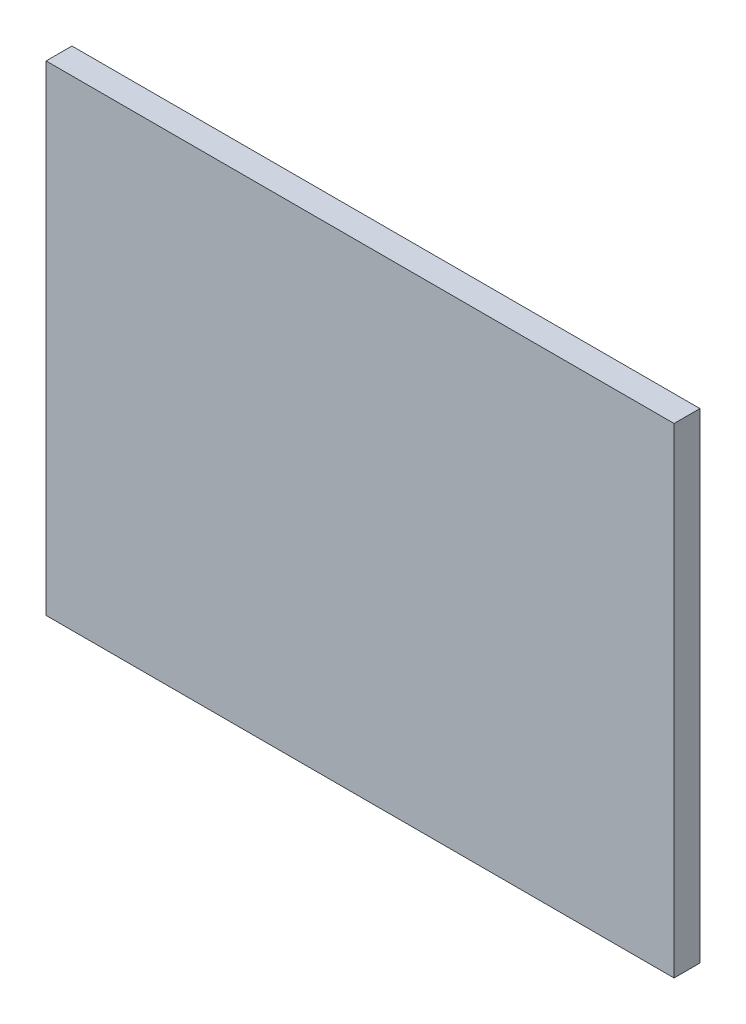
ISO-10303-21;
HEADER;
FILE_DESCRIPTION(('STEP AP214'),'2;1');
FILE_NAME('part.step','',(''),(''),'','','');
FILE_SCHEMA(('AUTOMOTIVE_DESIGN { 1 0 10303 214 1 1 1 1 }'));
ENDSEC;
DATA;
#1=APPLICATION_CONTEXT('core data for automotive mechanical design processes');
#2=APPLICATION_PROTOCOL_DEFINITION('international standard','automotive_design',2000,#1);
#3=PRODUCT_CONTEXT('',#1,'mechanical');
#4=PRODUCT('Part','Part','',(#3));
#5=PRODUCT_RELATED_PRODUCT_CATEGORY('part','',(#4));
#6=PRODUCT_DEFINITION_FORMATION('','',#4);
#7=PRODUCT_DEFINITION_CONTEXT('part definition',#1,'design');
#8=PRODUCT_DEFINITION('design','',#6,#7);
#9=PRODUCT_DEFINITION_SHAPE('','',#8);
#10=(LENGTH_UNIT() NAMED_UNIT(*) SI_UNIT(.MILLI.,.METRE.));
#11=(NAMED_UNIT(*) PLANE_ANGLE_UNIT() SI_UNIT($,.RADIAN.));
#12=(NAMED_UNIT(*) SI_UNIT($,.STERADIAN.) SOLID_ANGLE_UNIT());
#13=UNCERTAINTY_MEASURE_WITH_UNIT(LENGTH_MEASURE(1.E-05),#10,'distance_accuracy_value','');
#14=(GEOMETRIC_REPRESENTATION_CONTEXT(3) GLOBAL_UNCERTAINTY_ASSIGNED_CONTEXT((#13)) GLOBAL_UNIT_ASSIGNED_CONTEXT((#10,
#11,#12)) REPRESENTATION_CONTEXT('',''));
#15=CARTESIAN_POINT('',(0.,0.,0.));
#16=DIRECTION('',(0.,0.,1.));
#17=DIRECTION('',(1.,0.,0.));
#18=AXIS2_PLACEMENT_3D('',#15,#16,#17);
#19=CARTESIAN_POINT('',(872.3,756.75,0.));
#20=DIRECTION('',(1.,0.,0.));
#21=DIRECTION('',(0.,-1.,0.));
#22=AXIS2_PLACEMENT_3D('',#19,#20,#21);
#23=PLANE('',#22);
#24=DIRECTION('',(0.,-1.,0.));
#25=VECTOR('',#24,1.);
#26=CARTESIAN_POINT('',(872.3,756.75,0.0350012));
#27=LINE('',#26,#25);
#28=CARTESIAN_POINT('',(872.3,756.75,0.0350012));
#29=VERTEX_POINT('',#28);
#30=CARTESIAN_POINT('',(872.3,756.1,0.0350012));
#31=VERTEX_POINT('',#30);
#32=EDGE_CURVE('E11',#29,#31,#27,.T.);
#33=ORIENTED_EDGE('',*,*,#32,.F.);
#34=DIRECTION('',(0.,0.,1.));
#35=VECTOR('',#34,1.);
#36=CARTESIAN_POINT('',(872.3,756.75,0.));
#37=LINE('',#36,#35);
#38=CARTESIAN_POINT('',(872.3,756.75,0.));
#39=VERTEX_POINT('',#38);
#40=EDGE_CURVE('E24',#39,#29,#37,.T.);
#41=ORIENTED_EDGE('',*,*,#40,.F.);
#42=DIRECTION('',(0.,-1.,0.));
#43=VECTOR('',#42,1.);
#44=CARTESIAN_POINT('',(872.3,756.75,0.));
#45=LINE('',#44,#43);
#46=CARTESIAN_POINT('',(872.3,756.1,0.));
#47=VERTEX_POINT('',#46);
#48=EDGE_CURVE('E75',#39,#47,#45,.T.);
#49=ORIENTED_EDGE('',*,*,#48,.T.);
#50=DIRECTION('',(0.,0.,1.));
#51=VECTOR('',#50,1.);
#52=CARTESIAN_POINT('',(872.3,756.1,0.));
#53=LINE('',#52,#51);
#54=EDGE_CURVE('E37',#47,#31,#53,.T.);
#55=ORIENTED_EDGE('',*,*,#54,.T.);
#56=EDGE_LOOP('',(#33,#41,#49,#55));
#57=FACE_BOUND('',#56,.T.);
#58=ADVANCED_FACE('F17',(#57),#23,.F.);
#59=CARTESIAN_POINT('',(872.3,756.1,0.));
#60=DIRECTION('',(0.,1.,0.));
#61=DIRECTION('',(1.,0.,0.));
#62=AXIS2_PLACEMENT_3D('',#59,#60,#61);
#63=PLANE('',#62);
#64=DIRECTION('',(1.,0.,0.));
#65=VECTOR('',#64,1.);
#66=CARTESIAN_POINT('',(872.3,756.1,0.0350012));
#67=LINE('',#66,#65);
#68=CARTESIAN_POINT('',(873.15,756.1,0.0350012));
#69=VERTEX_POINT('',#68);
#70=EDGE_CURVE('E83',#31,#69,#67,.T.);
#71=ORIENTED_EDGE('',*,*,#70,.F.);
#72=ORIENTED_EDGE('',*,*,#54,.F.);
#73=DIRECTION('',(1.,0.,0.));
#74=VECTOR('',#73,1.);
#75=CARTESIAN_POINT('',(872.3,756.1,0.));
#76=LINE('',#75,#74);
#77=CARTESIAN_POINT('',(873.15,756.1,0.));
#78=VERTEX_POINT('',#77);
#79=EDGE_CURVE('E81',#47,#78,#76,.T.);
#80=ORIENTED_EDGE('',*,*,#79,.T.);
#81=DIRECTION('',(0.,0.,1.));
#82=VECTOR('',#81,1.);
#83=CARTESIAN_POINT('',(873.15,756.1,0.));
#84=LINE('',#83,#82);
#85=EDGE_CURVE('E67',#78,#69,#84,.T.);
#86=ORIENTED_EDGE('',*,*,#85,.T.);
#87=EDGE_LOOP('',(#71,#72,#80,#86));
#88=FACE_BOUND('',#87,.T.);
#89=ADVANCED_FACE('F89',(#88),#63,.F.);
#90=CARTESIAN_POINT('',(873.15,756.1,0.));
#91=DIRECTION('',(-1.,0.,0.));
#92=DIRECTION('',(0.,1.,0.));
#93=AXIS2_PLACEMENT_3D('',#90,#91,#92);
#94=PLANE('',#93);
#95=DIRECTION('',(0.,1.,0.));
#96=VECTOR('',#95,1.);
#97=CARTESIAN_POINT('',(873.15,756.1,0.0350012));
#98=LINE('',#97,#96);
#99=CARTESIAN_POINT('',(873.15,756.75,0.0350012));
#100=VERTEX_POINT('',#99);
#101=EDGE_CURVE('E71',#69,#100,#98,.T.);
#102=ORIENTED_EDGE('',*,*,#101,.F.);
#103=ORIENTED_EDGE('',*,*,#85,.F.);
#104=DIRECTION('',(0.,1.,0.));
#105=VECTOR('',#104,1.);
#106=CARTESIAN_POINT('',(873.15,756.1,0.));
#107=LINE('',#106,#105);
#108=CARTESIAN_POINT('',(873.15,756.75,0.));
#109=VERTEX_POINT('',#108);
#110=EDGE_CURVE('E63',#78,#109,#107,.T.);
#111=ORIENTED_EDGE('',*,*,#110,.T.);
#112=DIRECTION('',(0.,0.,1.));
#113=VECTOR('',#112,1.);
#114=CARTESIAN_POINT('',(873.15,756.75,0.));
#115=LINE('',#114,#113);
#116=EDGE_CURVE('E53',#109,#100,#115,.T.);
#117=ORIENTED_EDGE('',*,*,#116,.T.);
#118=EDGE_LOOP('',(#102,#103,#111,#117));
#119=FACE_BOUND('',#118,.T.);
#120=ADVANCED_FACE('F66',(#119),#94,.F.);
#121=CARTESIAN_POINT('',(873.15,756.75,0.));
#122=DIRECTION('',(0.,-1.,0.));
#123=DIRECTION('',(-1.,0.,0.));
#124=AXIS2_PLACEMENT_3D('',#121,#122,#123);
#125=PLANE('',#124);
#126=DIRECTION('',(-1.,0.,0.));
#127=VECTOR('',#126,1.);
#128=CARTESIAN_POINT('',(873.15,756.75,0.0350012));
#129=LINE('',#128,#127);
#130=EDGE_CURVE('E59',#100,#29,#129,.T.);
#131=ORIENTED_EDGE('',*,*,#130,.F.);
#132=ORIENTED_EDGE('',*,*,#116,.F.);
#133=DIRECTION('',(-1.,0.,0.));
#134=VECTOR('',#133,1.);
#135=CARTESIAN_POINT('',(873.15,756.75,0.));
#136=LINE('',#135,#134);
#137=EDGE_CURVE('E57',#109,#39,#136,.T.);
#138=ORIENTED_EDGE('',*,*,#137,.T.);
#139=ORIENTED_EDGE('',*,*,#40,.T.);
#140=EDGE_LOOP('',(#131,#132,#138,#139));
#141=FACE_BOUND('',#140,.T.);
#142=ADVANCED_FACE('F55',(#141),#125,.F.);
#143=CARTESIAN_POINT('',(872.725,756.425,0.));
#144=DIRECTION('',(0.,0.,1.));
#145=DIRECTION('',(1.,0.,0.));
#146=AXIS2_PLACEMENT_3D('',#143,#144,#145);
#147=PLANE('',#146);
#148=ORIENTED_EDGE('',*,*,#137,.F.);
#149=ORIENTED_EDGE('',*,*,#110,.F.);
#150=ORIENTED_EDGE('',*,*,#79,.F.);
#151=ORIENTED_EDGE('',*,*,#48,.F.);
#152=EDGE_LOOP('',(#148,#149,#150,#151));
#153=FACE_BOUND('',#152,.T.);
#154=ADVANCED_FACE('F74',(#153),#147,.F.);
#155=CARTESIAN_POINT('',(872.725,756.425,0.0350012));
#156=DIRECTION('',(0.,0.,1.));
#157=DIRECTION('',(1.,0.,0.));
#158=AXIS2_PLACEMENT_3D('',#155,#156,#157);
#159=PLANE('',#158);
#160=ORIENTED_EDGE('',*,*,#32,.T.);
#161=ORIENTED_EDGE('',*,*,#70,.T.);
#162=ORIENTED_EDGE('',*,*,#101,.T.);
#163=ORIENTED_EDGE('',*,*,#130,.T.);
#164=EDGE_LOOP('',(#160,#161,#162,#163));
#165=FACE_BOUND('',#164,.T.);
#166=ADVANCED_FACE('F91',(#165),#159,.T.);
#167=CLOSED_SHELL('',(#58,#89,#120,#142,#154,#166));
#168=MANIFOLD_SOLID_BREP('B1',#167);
#169=ADVANCED_BREP_SHAPE_REPRESENTATION('',(#18,#168),#14);
#170=SHAPE_DEFINITION_REPRESENTATION(#9,#169);
ENDSEC;
END-ISO-10303-21;
